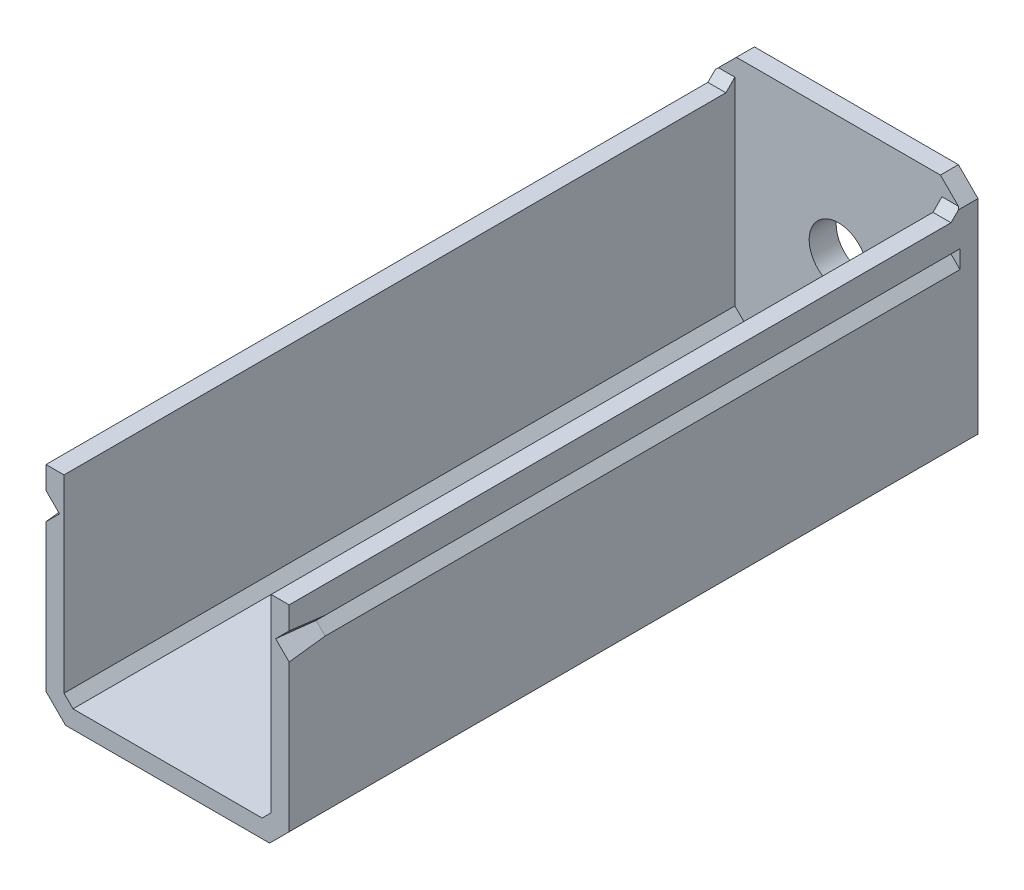
ISO-10303-21;
HEADER;
FILE_DESCRIPTION(('STEP AP214'),'2;1');
FILE_NAME('part.step','',(''),(''),'','','');
FILE_SCHEMA(('AUTOMOTIVE_DESIGN { 1 0 10303 214 1 1 1 1 }'));
ENDSEC;
DATA;
#1=APPLICATION_CONTEXT('core data for automotive mechanical design processes');
#2=APPLICATION_PROTOCOL_DEFINITION('international standard','automotive_design',2000,#1);
#3=PRODUCT_CONTEXT('',#1,'mechanical');
#4=PRODUCT('Part','Part','',(#3));
#5=PRODUCT_RELATED_PRODUCT_CATEGORY('part','',(#4));
#6=PRODUCT_DEFINITION_FORMATION('','',#4);
#7=PRODUCT_DEFINITION_CONTEXT('part definition',#1,'design');
#8=PRODUCT_DEFINITION('design','',#6,#7);
#9=PRODUCT_DEFINITION_SHAPE('','',#8);
#10=(LENGTH_UNIT() NAMED_UNIT(*) SI_UNIT(.MILLI.,.METRE.));
#11=(NAMED_UNIT(*) PLANE_ANGLE_UNIT() SI_UNIT($,.RADIAN.));
#12=(NAMED_UNIT(*) SI_UNIT($,.STERADIAN.) SOLID_ANGLE_UNIT());
#13=UNCERTAINTY_MEASURE_WITH_UNIT(LENGTH_MEASURE(1.E-05),#10,'distance_accuracy_value','');
#14=(GEOMETRIC_REPRESENTATION_CONTEXT(3) GLOBAL_UNCERTAINTY_ASSIGNED_CONTEXT((#13)) GLOBAL_UNIT_ASSIGNED_CONTEXT((#10,
#11,#12)) REPRESENTATION_CONTEXT('',''));
#15=CARTESIAN_POINT('',(0.,0.,0.));
#16=DIRECTION('',(0.,0.,1.));
#17=DIRECTION('',(1.,0.,0.));
#18=AXIS2_PLACEMENT_3D('',#15,#16,#17);
#19=CARTESIAN_POINT('',(13.5,27.,-38.25));
#20=DIRECTION('',(-1.,0.,0.));
#21=DIRECTION('',(0.,0.,1.));
#22=AXIS2_PLACEMENT_3D('',#19,#20,#21);
#23=PLANE('',#22);
#24=DIRECTION('',(0.,-1.,0.));
#25=VECTOR('',#24,1.);
#26=CARTESIAN_POINT('',(13.5,27.,38.25));
#27=LINE('',#26,#25);
#28=CARTESIAN_POINT('',(13.5,24.,38.25));
#29=VERTEX_POINT('',#28);
#30=CARTESIAN_POINT('',(13.5,21.494910618049,38.25));
#31=VERTEX_POINT('',#30);
#32=EDGE_CURVE('E551',#29,#31,#27,.T.);
#33=ORIENTED_EDGE('',*,*,#32,.T.);
#34=DIRECTION('',(0.,-0.122791346617475,-0.992432509138968));
#35=VECTOR('',#34,1.);
#36=CARTESIAN_POINT('',(13.5,21.3328635520294,36.9402922660383));
#37=LINE('',#36,#35);
#38=CARTESIAN_POINT('',(13.5,21.,34.2499999999999));
#39=VERTEX_POINT('',#38);
#40=EDGE_CURVE('E606',#31,#39,#37,.T.);
#41=ORIENTED_EDGE('',*,*,#40,.T.);
#42=DIRECTION('',(0.,0.,1.));
#43=VECTOR('',#42,1.);
#44=CARTESIAN_POINT('',(13.5,21.,-75.0467389859482));
#45=LINE('',#44,#43);
#46=CARTESIAN_POINT('',(13.5,21.,-36.25));
#47=VERTEX_POINT('',#46);
#48=EDGE_CURVE('E376',#47,#39,#45,.T.);
#49=ORIENTED_EDGE('',*,*,#48,.F.);
#50=DIRECTION('',(0.,-1.,0.));
#51=VECTOR('',#50,1.);
#52=CARTESIAN_POINT('',(13.5,0.,-36.25));
#53=LINE('',#52,#51);
#54=CARTESIAN_POINT('',(13.5,19.,-36.25));
#55=VERTEX_POINT('',#54);
#56=EDGE_CURVE('E368',#47,#55,#53,.T.);
#57=ORIENTED_EDGE('',*,*,#56,.T.);
#58=DIRECTION('',(0.,0.,1.));
#59=VECTOR('',#58,1.);
#60=CARTESIAN_POINT('',(13.5,19.,-75.0467389859482));
#61=LINE('',#60,#59);
#62=CARTESIAN_POINT('',(13.5,19.,34.2499999999998));
#63=VERTEX_POINT('',#62);
#64=EDGE_CURVE('E380',#55,#63,#61,.T.);
#65=ORIENTED_EDGE('',*,*,#64,.T.);
#66=DIRECTION('',(0.,-0.122791346617474,0.992432509138968));
#67=VECTOR('',#66,1.);
#68=CARTESIAN_POINT('',(13.5,18.7726804515995,36.0872573964694));
#69=LINE('',#68,#67);
#70=CARTESIAN_POINT('',(13.5,18.505089381951,38.25));
#71=VERTEX_POINT('',#70);
#72=EDGE_CURVE('E603',#63,#71,#69,.T.);
#73=ORIENTED_EDGE('',*,*,#72,.T.);
#74=CARTESIAN_POINT('',(13.5,2.1715728752538,38.25));
#75=VERTEX_POINT('',#74);
#76=EDGE_CURVE('E541',#71,#75,#27,.T.);
#77=ORIENTED_EDGE('',*,*,#76,.T.);
#78=DIRECTION('',(0.,0.,1.));
#79=VECTOR('',#78,1.);
#80=CARTESIAN_POINT('',(13.5,2.1715728752538,-39.25));
#81=LINE('',#80,#79);
#82=CARTESIAN_POINT('',(13.5,2.1715728752538,-38.25));
#83=VERTEX_POINT('',#82);
#84=EDGE_CURVE('E484',#83,#75,#81,.T.);
#85=ORIENTED_EDGE('',*,*,#84,.F.);
#86=DIRECTION('',(0.,-1.,0.));
#87=VECTOR('',#86,1.);
#88=CARTESIAN_POINT('',(13.5,27.,-38.25));
#89=LINE('',#88,#87);
#90=CARTESIAN_POINT('',(13.5,24.8284271247462,-38.25));
#91=VERTEX_POINT('',#90);
#92=EDGE_CURVE('E536',#91,#83,#89,.T.);
#93=ORIENTED_EDGE('',*,*,#92,.F.);
#94=DIRECTION('',(0.,0.,1.));
#95=VECTOR('',#94,1.);
#96=CARTESIAN_POINT('',(13.5,24.8284271247462,-39.25));
#97=LINE('',#96,#95);
#98=CARTESIAN_POINT('',(13.5,24.8284271247462,-36.0784271247462));
#99=VERTEX_POINT('',#98);
#100=EDGE_CURVE('E156',#91,#99,#97,.T.);
#101=ORIENTED_EDGE('',*,*,#100,.T.);
#102=DIRECTION('',(0.,0.70710678118655,-0.707106781186545));
#103=VECTOR('',#102,1.);
#104=CARTESIAN_POINT('',(13.5,27.,-38.25));
#105=LINE('',#104,#103);
#106=CARTESIAN_POINT('',(13.5,24.,-35.25));
#107=VERTEX_POINT('',#106);
#108=EDGE_CURVE('E149',#99,#107,#105,.F.);
#109=ORIENTED_EDGE('',*,*,#108,.T.);
#110=DIRECTION('',(0.,0.,1.));
#111=VECTOR('',#110,1.);
#112=CARTESIAN_POINT('',(13.5,24.,-75.0467389859482));
#113=LINE('',#112,#111);
#114=EDGE_CURVE('E354',#107,#29,#113,.T.);
#115=ORIENTED_EDGE('',*,*,#114,.T.);
#116=EDGE_LOOP('',(#33,#41,#49,#57,#65,#73,#77,#85,#93,#101,#109,#115));
#117=FACE_BOUND('',#116,.T.);
#118=ADVANCED_FACE('F139',(#117),#23,.F.);
#119=CARTESIAN_POINT('',(-13.5,27.,-38.25));
#120=DIRECTION('',(1.,0.,0.));
#121=DIRECTION('',(0.,0.,-1.));
#122=AXIS2_PLACEMENT_3D('',#119,#120,#121);
#123=PLANE('',#122);
#124=DIRECTION('',(0.,0.,1.));
#125=VECTOR('',#124,1.);
#126=CARTESIAN_POINT('',(-13.5,21.,-75.0467389859482));
#127=LINE('',#126,#125);
#128=CARTESIAN_POINT('',(-13.5,21.,-36.25));
#129=VERTEX_POINT('',#128);
#130=CARTESIAN_POINT('',(-13.5,21.,34.2499999999999));
#131=VERTEX_POINT('',#130);
#132=EDGE_CURVE('E332',#129,#131,#127,.T.);
#133=ORIENTED_EDGE('',*,*,#132,.T.);
#134=DIRECTION('',(0.,-0.122791346617472,-0.992432509138968));
#135=VECTOR('',#134,1.);
#136=CARTESIAN_POINT('',(-13.5,20.7399094196287,32.1478783571336));
#137=LINE('',#136,#135);
#138=CARTESIAN_POINT('',(-13.5,21.494910618049,38.25));
#139=VERTEX_POINT('',#138);
#140=EDGE_CURVE('E580',#131,#139,#137,.F.);
#141=ORIENTED_EDGE('',*,*,#140,.T.);
#142=DIRECTION('',(0.,-1.,0.));
#143=VECTOR('',#142,1.);
#144=CARTESIAN_POINT('',(-13.5,27.,38.25));
#145=LINE('',#144,#143);
#146=CARTESIAN_POINT('',(-13.5,24.,38.25));
#147=VERTEX_POINT('',#146);
#148=EDGE_CURVE('E555',#147,#139,#145,.T.);
#149=ORIENTED_EDGE('',*,*,#148,.F.);
#150=DIRECTION('',(0.,0.,1.));
#151=VECTOR('',#150,1.);
#152=CARTESIAN_POINT('',(-13.5,24.,-75.0467389859482));
#153=LINE('',#152,#151);
#154=CARTESIAN_POINT('',(-13.5,24.,-35.25));
#155=VERTEX_POINT('',#154);
#156=EDGE_CURVE('E425',#155,#147,#153,.T.);
#157=ORIENTED_EDGE('',*,*,#156,.F.);
#158=DIRECTION('',(0.,-0.70710678118655,0.707106781186545));
#159=VECTOR('',#158,1.);
#160=CARTESIAN_POINT('',(-13.5,27.,-38.25));
#161=LINE('',#160,#159);
#162=CARTESIAN_POINT('',(-13.5,24.8284271247462,-36.0784271247462));
#163=VERTEX_POINT('',#162);
#164=EDGE_CURVE('E635',#155,#163,#161,.F.);
#165=ORIENTED_EDGE('',*,*,#164,.T.);
#166=DIRECTION('',(0.,0.,1.));
#167=VECTOR('',#166,1.);
#168=CARTESIAN_POINT('',(-13.5,24.8284271247462,-39.25));
#169=LINE('',#168,#167);
#170=CARTESIAN_POINT('',(-13.5,24.8284271247462,-38.25));
#171=VERTEX_POINT('',#170);
#172=EDGE_CURVE('E164',#171,#163,#169,.T.);
#173=ORIENTED_EDGE('',*,*,#172,.F.);
#174=DIRECTION('',(0.,-1.,0.));
#175=VECTOR('',#174,1.);
#176=CARTESIAN_POINT('',(-13.5,27.,-38.25));
#177=LINE('',#176,#175);
#178=CARTESIAN_POINT('',(-13.5,2.1715728752538,-38.25));
#179=VERTEX_POINT('',#178);
#180=EDGE_CURVE('E556',#171,#179,#177,.T.);
#181=ORIENTED_EDGE('',*,*,#180,.T.);
#182=DIRECTION('',(0.,0.,1.));
#183=VECTOR('',#182,1.);
#184=CARTESIAN_POINT('',(-13.5,2.1715728752538,-39.25));
#185=LINE('',#184,#183);
#186=CARTESIAN_POINT('',(-13.5,2.1715728752538,38.25));
#187=VERTEX_POINT('',#186);
#188=EDGE_CURVE('E493',#179,#187,#185,.T.);
#189=ORIENTED_EDGE('',*,*,#188,.T.);
#190=CARTESIAN_POINT('',(-13.5,18.505089381951,38.25));
#191=VERTEX_POINT('',#190);
#192=EDGE_CURVE('E552',#191,#187,#145,.T.);
#193=ORIENTED_EDGE('',*,*,#192,.F.);
#194=DIRECTION('',(0.,-0.122791346617473,0.992432509138968));
#195=VECTOR('',#194,1.);
#196=CARTESIAN_POINT('',(-13.5,18.9585362842887,34.5851208416162));
#197=LINE('',#196,#195);
#198=CARTESIAN_POINT('',(-13.5,19.,34.2499999999998));
#199=VERTEX_POINT('',#198);
#200=EDGE_CURVE('E577',#191,#199,#197,.F.);
#201=ORIENTED_EDGE('',*,*,#200,.T.);
#202=DIRECTION('',(0.,0.,1.));
#203=VECTOR('',#202,1.);
#204=CARTESIAN_POINT('',(-13.5,19.,-75.0467389859482));
#205=LINE('',#204,#203);
#206=CARTESIAN_POINT('',(-13.5,19.,-36.25));
#207=VERTEX_POINT('',#206);
#208=EDGE_CURVE('E343',#207,#199,#205,.T.);
#209=ORIENTED_EDGE('',*,*,#208,.F.);
#210=DIRECTION('',(0.,1.,0.));
#211=VECTOR('',#210,1.);
#212=CARTESIAN_POINT('',(-13.5,0.,-36.25));
#213=LINE('',#212,#211);
#214=EDGE_CURVE('E349',#207,#129,#213,.T.);
#215=ORIENTED_EDGE('',*,*,#214,.T.);
#216=EDGE_LOOP('',(#133,#141,#149,#157,#165,#173,#181,#189,#193,#201,#209,#215));
#217=FACE_BOUND('',#216,.T.);
#218=ADVANCED_FACE('F356',(#217),#123,.F.);
#219=CARTESIAN_POINT('',(-13.5,27.,38.25));
#220=DIRECTION('',(0.,0.,-1.));
#221=DIRECTION('',(-1.,0.,0.));
#222=AXIS2_PLACEMENT_3D('',#219,#220,#221);
#223=PLANE('',#222);
#224=DIRECTION('',(-0.707106781186549,0.707106781186546,0.));
#225=VECTOR('',#224,1.);
#226=CARTESIAN_POINT('',(12.2525446909755,19.7525446909755,38.25));
#227=LINE('',#226,#225);
#228=CARTESIAN_POINT('',(12.005089381951,20.,38.25));
#229=VERTEX_POINT('',#228);
#230=EDGE_CURVE('E592',#71,#229,#227,.T.);
#231=ORIENTED_EDGE('',*,*,#230,.T.);
#232=DIRECTION('',(0.707106781186551,0.707106781186544,0.));
#233=VECTOR('',#232,1.);
#234=CARTESIAN_POINT('',(13.2525446909755,21.2474553090245,38.25));
#235=LINE('',#234,#233);
#236=EDGE_CURVE('E599',#229,#31,#235,.T.);
#237=ORIENTED_EDGE('',*,*,#236,.T.);
#238=ORIENTED_EDGE('',*,*,#32,.F.);
#239=DIRECTION('',(-1.,0.,0.));
#240=VECTOR('',#239,1.);
#241=CARTESIAN_POINT('',(0.,24.,38.25));
#242=LINE('',#241,#240);
#243=CARTESIAN_POINT('',(11.5,24.,38.25));
#244=VERTEX_POINT('',#243);
#245=EDGE_CURVE('E392',#29,#244,#242,.T.);
#246=ORIENTED_EDGE('',*,*,#245,.T.);
#247=DIRECTION('',(0.,-1.,0.));
#248=VECTOR('',#247,1.);
#249=CARTESIAN_POINT('',(11.5,0.,38.25));
#250=LINE('',#249,#248);
#251=CARTESIAN_POINT('',(11.5,2.99999999999999,38.25));
#252=VERTEX_POINT('',#251);
#253=EDGE_CURVE('E397',#244,#252,#250,.T.);
#254=ORIENTED_EDGE('',*,*,#253,.T.);
#255=DIRECTION('',(0.707106781186557,0.707106781186538,0.));
#256=VECTOR('',#255,1.);
#257=CARTESIAN_POINT('',(4.24999999999985,-4.24999999999996,38.25));
#258=LINE('',#257,#256);
#259=CARTESIAN_POINT('',(10.5,2.00000000000001,38.25));
#260=VERTEX_POINT('',#259);
#261=EDGE_CURVE('E403',#260,#252,#258,.T.);
#262=ORIENTED_EDGE('',*,*,#261,.F.);
#263=DIRECTION('',(1.,0.,0.));
#264=VECTOR('',#263,1.);
#265=CARTESIAN_POINT('',(0.,2.00000000000001,38.25));
#266=LINE('',#265,#264);
#267=CARTESIAN_POINT('',(-10.5,2.00000000000001,38.25));
#268=VERTEX_POINT('',#267);
#269=EDGE_CURVE('E408',#268,#260,#266,.T.);
#270=ORIENTED_EDGE('',*,*,#269,.F.);
#271=DIRECTION('',(0.707106781186549,-0.707106781186546,0.));
#272=VECTOR('',#271,1.);
#273=CARTESIAN_POINT('',(-4.24999999999999,-4.25,38.25));
#274=LINE('',#273,#272);
#275=CARTESIAN_POINT('',(-11.5,2.99999999999999,38.25));
#276=VERTEX_POINT('',#275);
#277=EDGE_CURVE('E412',#276,#268,#274,.T.);
#278=ORIENTED_EDGE('',*,*,#277,.F.);
#279=DIRECTION('',(0.,-1.,0.));
#280=VECTOR('',#279,1.);
#281=CARTESIAN_POINT('',(-11.5,0.,38.25));
#282=LINE('',#281,#280);
#283=CARTESIAN_POINT('',(-11.5,24.,38.25));
#284=VERTEX_POINT('',#283);
#285=EDGE_CURVE('E416',#284,#276,#282,.T.);
#286=ORIENTED_EDGE('',*,*,#285,.F.);
#287=DIRECTION('',(-1.,0.,0.));
#288=VECTOR('',#287,1.);
#289=CARTESIAN_POINT('',(0.,24.,38.25));
#290=LINE('',#289,#288);
#291=EDGE_CURVE('E421',#284,#147,#290,.T.);
#292=ORIENTED_EDGE('',*,*,#291,.T.);
#293=ORIENTED_EDGE('',*,*,#148,.T.);
#294=DIRECTION('',(0.707106781186549,-0.707106781186546,0.));
#295=VECTOR('',#294,1.);
#296=CARTESIAN_POINT('',(-16.2525446909755,24.2474553090245,38.25));
#297=LINE('',#296,#295);
#298=CARTESIAN_POINT('',(-12.005089381951,20.,38.25));
#299=VERTEX_POINT('',#298);
#300=EDGE_CURVE('E586',#139,#299,#297,.T.);
#301=ORIENTED_EDGE('',*,*,#300,.T.);
#302=DIRECTION('',(-0.707106781186549,-0.707106781186546,0.));
#303=VECTOR('',#302,1.);
#304=CARTESIAN_POINT('',(-9.2525446909755,22.7525446909755,38.25));
#305=LINE('',#304,#303);
#306=EDGE_CURVE('E583',#299,#191,#305,.T.);
#307=ORIENTED_EDGE('',*,*,#306,.T.);
#308=ORIENTED_EDGE('',*,*,#192,.T.);
#309=DIRECTION('',(0.707106781186548,-0.707106781186547,0.));
#310=VECTOR('',#309,1.);
#311=CARTESIAN_POINT('',(-5.6642135623731,-5.6642135623731,38.25));
#312=LINE('',#311,#310);
#313=CARTESIAN_POINT('',(-11.3284271247462,0.,38.25));
#314=VERTEX_POINT('',#313);
#315=EDGE_CURVE('E481',#187,#314,#312,.T.);
#316=ORIENTED_EDGE('',*,*,#315,.T.);
#317=DIRECTION('',(1.,0.,0.));
#318=VECTOR('',#317,1.);
#319=CARTESIAN_POINT('',(-13.5,0.,38.25));
#320=LINE('',#319,#318);
#321=CARTESIAN_POINT('',(11.3284271247462,0.,38.25));
#322=VERTEX_POINT('',#321);
#323=EDGE_CURVE('E542',#314,#322,#320,.T.);
#324=ORIENTED_EDGE('',*,*,#323,.T.);
#325=DIRECTION('',(-0.707106781186548,-0.707106781186547,0.));
#326=VECTOR('',#325,1.);
#327=CARTESIAN_POINT('',(5.66421356237309,-5.6642135623731,38.25));
#328=LINE('',#327,#326);
#329=EDGE_CURVE('E431',#75,#322,#328,.T.);
#330=ORIENTED_EDGE('',*,*,#329,.F.);
#331=ORIENTED_EDGE('',*,*,#76,.F.);
#332=EDGE_LOOP('',(#231,#237,#238,#246,#254,#262,#270,#278,#286,#292,#293,#301,#307,#308,#316,
#324,#330,#331));
#333=FACE_BOUND('',#332,.T.);
#334=ADVANCED_FACE('F663',(#333),#223,.F.);
#335=CARTESIAN_POINT('',(0.,27.,0.));
#336=DIRECTION('',(0.,1.,0.));
#337=DIRECTION('',(0.,0.,1.));
#338=AXIS2_PLACEMENT_3D('',#335,#336,#337);
#339=PLANE('',#338);
#340=DIRECTION('',(0.,0.,-1.));
#341=VECTOR('',#340,1.);
#342=CARTESIAN_POINT('',(-11.3284271247462,27.,0.));
#343=LINE('',#342,#341);
#344=CARTESIAN_POINT('',(-11.3284271247462,27.,-36.25));
#345=VERTEX_POINT('',#344);
#346=CARTESIAN_POINT('',(-11.3284271247462,27.,-38.25));
#347=VERTEX_POINT('',#346);
#348=EDGE_CURVE('E569',#345,#347,#343,.T.);
#349=ORIENTED_EDGE('',*,*,#348,.F.);
#350=DIRECTION('',(1.,0.,0.));
#351=VECTOR('',#350,1.);
#352=CARTESIAN_POINT('',(0.,27.,-36.25));
#353=LINE('',#352,#351);
#354=CARTESIAN_POINT('',(11.3284271247462,27.,-36.25));
#355=VERTEX_POINT('',#354);
#356=EDGE_CURVE('E432',#345,#355,#353,.T.);
#357=ORIENTED_EDGE('',*,*,#356,.T.);
#358=DIRECTION('',(0.,0.,-1.));
#359=VECTOR('',#358,1.);
#360=CARTESIAN_POINT('',(11.3284271247462,27.,0.));
#361=LINE('',#360,#359);
#362=CARTESIAN_POINT('',(11.3284271247462,27.,-38.25));
#363=VERTEX_POINT('',#362);
#364=EDGE_CURVE('E572',#355,#363,#361,.T.);
#365=ORIENTED_EDGE('',*,*,#364,.T.);
#366=DIRECTION('',(-1.,0.,0.));
#367=VECTOR('',#366,1.);
#368=CARTESIAN_POINT('',(-13.5,27.,-38.25));
#369=LINE('',#368,#367);
#370=EDGE_CURVE('E537',#363,#347,#369,.T.);
#371=ORIENTED_EDGE('',*,*,#370,.T.);
#372=EDGE_LOOP('',(#349,#357,#365,#371));
#373=FACE_BOUND('',#372,.T.);
#374=ADVANCED_FACE('F737',(#373),#339,.T.);
#375=CARTESIAN_POINT('',(0.,10.65,38.25));
#376=DIRECTION('',(0.,-1.,0.));
#377=DIRECTION('',(1.,0.,0.));
#378=AXIS2_PLACEMENT_3D('',#375,#376,#377);
#379=PLANE('',#378);
#380=DIRECTION('',(1.,0.,0.));
#381=VECTOR('',#380,1.);
#382=CARTESIAN_POINT('',(0.,10.65,-36.25));
#383=LINE('',#382,#381);
#384=CARTESIAN_POINT('',(-1.56204993518134,10.65,-36.25));
#385=VERTEX_POINT('',#384);
#386=CARTESIAN_POINT('',(1.56204993518132,10.65,-36.25));
#387=VERTEX_POINT('',#386);
#388=EDGE_CURVE('E407',#385,#387,#383,.T.);
#389=ORIENTED_EDGE('',*,*,#388,.T.);
#390=DIRECTION('',(0.,0.,-1.));
#391=VECTOR('',#390,1.);
#392=CARTESIAN_POINT('',(1.56204993518132,10.65,38.25));
#393=LINE('',#392,#391);
#394=CARTESIAN_POINT('',(1.56204993518132,10.65,-39.25));
#395=VERTEX_POINT('',#394);
#396=EDGE_CURVE('E521',#387,#395,#393,.T.);
#397=ORIENTED_EDGE('',*,*,#396,.T.);
#398=DIRECTION('',(-1.,0.,0.));
#399=VECTOR('',#398,1.);
#400=CARTESIAN_POINT('',(0.,10.65,-39.25));
#401=LINE('',#400,#399);
#402=CARTESIAN_POINT('',(-1.56204993518134,10.65,-39.25));
#403=VERTEX_POINT('',#402);
#404=EDGE_CURVE('E512',#395,#403,#401,.T.);
#405=ORIENTED_EDGE('',*,*,#404,.T.);
#406=DIRECTION('',(0.,0.,-1.));
#407=VECTOR('',#406,1.);
#408=CARTESIAN_POINT('',(-1.56204993518134,10.65,38.25));
#409=LINE('',#408,#407);
#410=EDGE_CURVE('E520',#385,#403,#409,.T.);
#411=ORIENTED_EDGE('',*,*,#410,.F.);
#412=EDGE_LOOP('',(#389,#397,#405,#411));
#413=FACE_BOUND('',#412,.T.);
#414=ADVANCED_FACE('F739',(#413),#379,.F.);
#415=CARTESIAN_POINT('',(0.,13.5,38.25));
#416=DIRECTION('',(0.,0.,-1.));
#417=DIRECTION('',(-1.,0.,0.));
#418=AXIS2_PLACEMENT_3D('',#415,#416,#417);
#419=CYLINDRICAL_SURFACE('',#418,3.25);
#420=CARTESIAN_POINT('',(0.,13.5,-36.25));
#421=DIRECTION('',(0.,0.,1.));
#422=DIRECTION('',(1.,0.,0.));
#423=AXIS2_PLACEMENT_3D('',#420,#421,#422);
#424=CIRCLE('',#423,3.25);
#425=EDGE_CURVE('E455',#387,#385,#424,.T.);
#426=ORIENTED_EDGE('',*,*,#425,.T.);
#427=ORIENTED_EDGE('',*,*,#410,.T.);
#428=CARTESIAN_POINT('',(0.,13.5,-39.25));
#429=DIRECTION('',(0.,0.,-1.));
#430=DIRECTION('',(-1.,0.,0.));
#431=AXIS2_PLACEMENT_3D('',#428,#429,#430);
#432=CIRCLE('',#431,3.25);
#433=EDGE_CURVE('E516',#403,#395,#432,.T.);
#434=ORIENTED_EDGE('',*,*,#433,.T.);
#435=ORIENTED_EDGE('',*,*,#396,.F.);
#436=EDGE_LOOP('',(#426,#427,#434,#435));
#437=FACE_BOUND('',#436,.T.);
#438=ADVANCED_FACE('F745',(#437),#419,.F.);
#439=CARTESIAN_POINT('',(-19.1642135623731,19.1642135623731,-39.25));
#440=DIRECTION('',(0.707106781186547,-0.707106781186548,0.));
#441=DIRECTION('',(0.707106781186548,0.707106781186547,0.));
#442=AXIS2_PLACEMENT_3D('',#439,#440,#441);
#443=PLANE('',#442);
#444=DIRECTION('',(-0.707106781186548,-0.707106781186547,0.));
#445=VECTOR('',#444,1.);
#446=CARTESIAN_POINT('',(-19.1642135623731,19.1642135623731,-36.25));
#447=LINE('',#446,#445);
#448=CARTESIAN_POINT('',(-13.3284271247462,25.,-36.25));
#449=VERTEX_POINT('',#448);
#450=EDGE_CURVE('E420',#345,#449,#447,.T.);
#451=ORIENTED_EDGE('',*,*,#450,.F.);
#452=ORIENTED_EDGE('',*,*,#348,.T.);
#453=DIRECTION('',(0.707106781186548,0.707106781186547,0.));
#454=VECTOR('',#453,1.);
#455=CARTESIAN_POINT('',(-12.4142135623731,25.9142135623731,-38.25));
#456=LINE('',#455,#454);
#457=EDGE_CURVE('E504',#171,#347,#456,.T.);
#458=ORIENTED_EDGE('',*,*,#457,.F.);
#459=ORIENTED_EDGE('',*,*,#172,.T.);
#460=DIRECTION('',(-0.577350269189627,-0.577350269189627,0.577350269189623));
#461=VECTOR('',#460,1.);
#462=CARTESIAN_POINT('',(-16.2189514164975,22.1094757082487,-33.3594757082487));
#463=LINE('',#462,#461);
#464=EDGE_CURVE('E638',#163,#449,#463,.F.);
#465=ORIENTED_EDGE('',*,*,#464,.T.);
#466=EDGE_LOOP('',(#451,#452,#458,#459,#465));
#467=FACE_BOUND('',#466,.T.);
#468=ADVANCED_FACE('F734',(#467),#443,.F.);
#469=CARTESIAN_POINT('',(19.1642135623731,19.1642135623731,-39.25));
#470=DIRECTION('',(0.707106781186547,0.707106781186548,0.));
#471=DIRECTION('',(-0.707106781186548,0.707106781186547,0.));
#472=AXIS2_PLACEMENT_3D('',#469,#470,#471);
#473=PLANE('',#472);
#474=ORIENTED_EDGE('',*,*,#364,.F.);
#475=DIRECTION('',(0.707106781186548,-0.707106781186547,0.));
#476=VECTOR('',#475,1.);
#477=CARTESIAN_POINT('',(19.1642135623731,19.1642135623731,-36.25));
#478=LINE('',#477,#476);
#479=CARTESIAN_POINT('',(13.3284271247462,25.,-36.25));
#480=VERTEX_POINT('',#479);
#481=EDGE_CURVE('E427',#355,#480,#478,.T.);
#482=ORIENTED_EDGE('',*,*,#481,.T.);
#483=DIRECTION('',(-0.577350269189627,0.577350269189627,-0.577350269189623));
#484=VECTOR('',#483,1.);
#485=CARTESIAN_POINT('',(4.38561808316408,33.9428090415821,-45.1928090415821));
#486=LINE('',#485,#484);
#487=EDGE_CURVE('E641',#480,#99,#486,.F.);
#488=ORIENTED_EDGE('',*,*,#487,.T.);
#489=ORIENTED_EDGE('',*,*,#100,.F.);
#490=DIRECTION('',(-0.707106781186548,0.707106781186547,0.));
#491=VECTOR('',#490,1.);
#492=CARTESIAN_POINT('',(-1.08578643762691,39.4142135623731,-38.25));
#493=LINE('',#492,#491);
#494=EDGE_CURVE('E508',#91,#363,#493,.T.);
#495=ORIENTED_EDGE('',*,*,#494,.T.);
#496=EDGE_LOOP('',(#474,#482,#488,#489,#495));
#497=FACE_BOUND('',#496,.T.);
#498=ADVANCED_FACE('F704',(#497),#473,.T.);
#499=CARTESIAN_POINT('',(-13.5,27.,-38.25));
#500=DIRECTION('',(0.,0.,1.));
#501=DIRECTION('',(1.,0.,0.));
#502=AXIS2_PLACEMENT_3D('',#499,#500,#501);
#503=PLANE('',#502);
#504=CARTESIAN_POINT('',(0.,13.5,-38.25));
#505=DIRECTION('',(0.,0.,1.));
#506=DIRECTION('',(1.,0.,0.));
#507=AXIS2_PLACEMENT_3D('',#504,#505,#506);
#508=CIRCLE('',#507,5.75);
#509=CARTESIAN_POINT('',(5.74999999999999,13.5,-38.25));
#510=VERTEX_POINT('',#509);
#511=EDGE_CURVE('E531',#510,#510,#508,.F.);
#512=ORIENTED_EDGE('',*,*,#511,.F.);
#513=EDGE_LOOP('',(#512));
#514=FACE_BOUND('',#513,.T.);
#515=ORIENTED_EDGE('',*,*,#92,.T.);
#516=DIRECTION('',(-0.707106781186548,-0.707106781186547,0.));
#517=VECTOR('',#516,1.);
#518=CARTESIAN_POINT('',(12.4142135623731,1.08578643762689,-38.25));
#519=LINE('',#518,#517);
#520=CARTESIAN_POINT('',(11.3284271247462,0.,-38.25));
#521=VERTEX_POINT('',#520);
#522=EDGE_CURVE('E500',#83,#521,#519,.T.);
#523=ORIENTED_EDGE('',*,*,#522,.T.);
#524=DIRECTION('',(-1.,0.,0.));
#525=VECTOR('',#524,1.);
#526=CARTESIAN_POINT('',(-13.5,0.,-38.25));
#527=LINE('',#526,#525);
#528=CARTESIAN_POINT('',(-11.3284271247462,0.,-38.25));
#529=VERTEX_POINT('',#528);
#530=EDGE_CURVE('E530',#521,#529,#527,.T.);
#531=ORIENTED_EDGE('',*,*,#530,.T.);
#532=DIRECTION('',(0.707106781186548,-0.707106781186547,0.));
#533=VECTOR('',#532,1.);
#534=CARTESIAN_POINT('',(-25.9142135623731,14.5857864376269,-38.25));
#535=LINE('',#534,#533);
#536=EDGE_CURVE('E497',#179,#529,#535,.T.);
#537=ORIENTED_EDGE('',*,*,#536,.F.);
#538=ORIENTED_EDGE('',*,*,#180,.F.);
#539=ORIENTED_EDGE('',*,*,#457,.T.);
#540=ORIENTED_EDGE('',*,*,#370,.F.);
#541=ORIENTED_EDGE('',*,*,#494,.F.);
#542=EDGE_LOOP('',(#515,#523,#531,#537,#538,#539,#540,#541));
#543=FACE_BOUND('',#542,.T.);
#544=ADVANCED_FACE('F689',(#514,#543),#503,.F.);
#545=CARTESIAN_POINT('',(0.,0.,0.));
#546=DIRECTION('',(0.,1.,0.));
#547=DIRECTION('',(0.,0.,1.));
#548=AXIS2_PLACEMENT_3D('',#545,#546,#547);
#549=PLANE('',#548);
#550=ORIENTED_EDGE('',*,*,#530,.F.);
#551=DIRECTION('',(0.,0.,1.));
#552=VECTOR('',#551,1.);
#553=CARTESIAN_POINT('',(11.3284271247462,0.,0.));
#554=LINE('',#553,#552);
#555=EDGE_CURVE('E565',#521,#322,#554,.T.);
#556=ORIENTED_EDGE('',*,*,#555,.T.);
#557=ORIENTED_EDGE('',*,*,#323,.F.);
#558=DIRECTION('',(0.,0.,1.));
#559=VECTOR('',#558,1.);
#560=CARTESIAN_POINT('',(-11.3284271247462,0.,0.));
#561=LINE('',#560,#559);
#562=EDGE_CURVE('E535',#529,#314,#561,.T.);
#563=ORIENTED_EDGE('',*,*,#562,.F.);
#564=EDGE_LOOP('',(#550,#556,#557,#563));
#565=FACE_BOUND('',#564,.T.);
#566=ADVANCED_FACE('F692',(#565),#549,.F.);
#567=CARTESIAN_POINT('',(0.,13.5,-39.25));
#568=DIRECTION('',(0.,0.,-1.));
#569=DIRECTION('',(-1.,0.,0.));
#570=AXIS2_PLACEMENT_3D('',#567,#568,#569);
#571=PLANE('',#570);
#572=ORIENTED_EDGE('',*,*,#404,.F.);
#573=ORIENTED_EDGE('',*,*,#433,.F.);
#574=EDGE_LOOP('',(#572,#573));
#575=FACE_BOUND('',#574,.T.);
#576=CARTESIAN_POINT('',(0.,13.5,-39.25));
#577=DIRECTION('',(0.,0.,-1.));
#578=DIRECTION('',(-1.,0.,0.));
#579=AXIS2_PLACEMENT_3D('',#576,#577,#578);
#580=CIRCLE('',#579,4.75);
#581=CARTESIAN_POINT('',(-4.75000000000001,13.5,-39.25));
#582=VERTEX_POINT('',#581);
#583=EDGE_CURVE('E524',#582,#582,#580,.T.);
#584=ORIENTED_EDGE('',*,*,#583,.T.);
#585=EDGE_LOOP('',(#584));
#586=FACE_BOUND('',#585,.T.);
#587=ADVANCED_FACE('F1023',(#575,#586),#571,.T.);
#588=CARTESIAN_POINT('',(0.,13.5,-39.25));
#589=DIRECTION('',(0.,0.,1.));
#590=DIRECTION('',(-1.,0.,0.));
#591=AXIS2_PLACEMENT_3D('',#588,#589,#590);
#592=CONICAL_SURFACE('',#591,4.75,0.78539816339745);
#593=ORIENTED_EDGE('',*,*,#583,.F.);
#594=EDGE_LOOP('',(#593));
#595=FACE_BOUND('',#594,.T.);
#596=ORIENTED_EDGE('',*,*,#511,.T.);
#597=EDGE_LOOP('',(#596));
#598=FACE_BOUND('',#597,.T.);
#599=ADVANCED_FACE('F1005',(#595,#598),#592,.T.);
#600=CARTESIAN_POINT('',(-5.6642135623731,-5.6642135623731,-39.25));
#601=DIRECTION('',(-0.707106781186547,-0.707106781186548,0.));
#602=DIRECTION('',(0.707106781186548,-0.707106781186547,0.));
#603=AXIS2_PLACEMENT_3D('',#600,#601,#602);
#604=PLANE('',#603);
#605=ORIENTED_EDGE('',*,*,#536,.T.);
#606=ORIENTED_EDGE('',*,*,#562,.T.);
#607=ORIENTED_EDGE('',*,*,#315,.F.);
#608=ORIENTED_EDGE('',*,*,#188,.F.);
#609=EDGE_LOOP('',(#605,#606,#607,#608));
#610=FACE_BOUND('',#609,.T.);
#611=ADVANCED_FACE('F686',(#610),#604,.T.);
#612=CARTESIAN_POINT('',(5.66421356237309,-5.6642135623731,-39.25));
#613=DIRECTION('',(-0.707106781186547,0.707106781186548,0.));
#614=DIRECTION('',(-0.707106781186548,-0.707106781186547,0.));
#615=AXIS2_PLACEMENT_3D('',#612,#613,#614);
#616=PLANE('',#615);
#617=ORIENTED_EDGE('',*,*,#84,.T.);
#618=ORIENTED_EDGE('',*,*,#329,.T.);
#619=ORIENTED_EDGE('',*,*,#555,.F.);
#620=ORIENTED_EDGE('',*,*,#522,.F.);
#621=EDGE_LOOP('',(#617,#618,#619,#620));
#622=FACE_BOUND('',#621,.T.);
#623=ADVANCED_FACE('F698',(#622),#616,.F.);
#624=CARTESIAN_POINT('',(0.,24.,-75.0467389859482));
#625=DIRECTION('',(0.,1.,0.));
#626=DIRECTION('',(0.,0.,1.));
#627=AXIS2_PLACEMENT_3D('',#624,#625,#626);
#628=PLANE('',#627);
#629=ORIENTED_EDGE('',*,*,#114,.F.);
#630=DIRECTION('',(-1.,0.,0.));
#631=VECTOR('',#630,1.);
#632=CARTESIAN_POINT('',(11.5,24.,-35.25));
#633=LINE('',#632,#631);
#634=CARTESIAN_POINT('',(11.5,24.,-35.25));
#635=VERTEX_POINT('',#634);
#636=EDGE_CURVE('E629',#107,#635,#633,.T.);
#637=ORIENTED_EDGE('',*,*,#636,.T.);
#638=DIRECTION('',(0.,0.,1.));
#639=VECTOR('',#638,1.);
#640=CARTESIAN_POINT('',(11.5,24.,-75.0467389859482));
#641=LINE('',#640,#639);
#642=EDGE_CURVE('E402',#635,#244,#641,.T.);
#643=ORIENTED_EDGE('',*,*,#642,.T.);
#644=ORIENTED_EDGE('',*,*,#245,.F.);
#645=EDGE_LOOP('',(#629,#637,#643,#644));
#646=FACE_BOUND('',#645,.T.);
#647=ADVANCED_FACE('F651',(#646),#628,.T.);
#648=CARTESIAN_POINT('',(11.5,0.,-75.0467389859482));
#649=DIRECTION('',(-1.,0.,0.));
#650=DIRECTION('',(0.,-1.,0.));
#651=AXIS2_PLACEMENT_3D('',#648,#649,#650);
#652=PLANE('',#651);
#653=DIRECTION('',(0.,0.,1.));
#654=VECTOR('',#653,1.);
#655=CARTESIAN_POINT('',(11.5,2.99999999999999,-75.0467389859482));
#656=LINE('',#655,#654);
#657=CARTESIAN_POINT('',(11.5,2.99999999999999,-36.25));
#658=VERTEX_POINT('',#657);
#659=EDGE_CURVE('E401',#658,#252,#656,.T.);
#660=ORIENTED_EDGE('',*,*,#659,.T.);
#661=ORIENTED_EDGE('',*,*,#253,.F.);
#662=ORIENTED_EDGE('',*,*,#642,.F.);
#663=DIRECTION('',(0.,-0.70710678118655,0.707106781186545));
#664=VECTOR('',#663,1.);
#665=CARTESIAN_POINT('',(11.5,25.,-36.25));
#666=LINE('',#665,#664);
#667=CARTESIAN_POINT('',(11.5,25.,-36.25));
#668=VERTEX_POINT('',#667);
#669=EDGE_CURVE('E13',#635,#668,#666,.F.);
#670=ORIENTED_EDGE('',*,*,#669,.T.);
#671=DIRECTION('',(0.,1.,0.));
#672=VECTOR('',#671,1.);
#673=CARTESIAN_POINT('',(11.5,0.,-36.25));
#674=LINE('',#673,#672);
#675=EDGE_CURVE('E396',#658,#668,#674,.T.);
#676=ORIENTED_EDGE('',*,*,#675,.F.);
#677=EDGE_LOOP('',(#660,#661,#662,#670,#676));
#678=FACE_BOUND('',#677,.T.);
#679=ADVANCED_FACE('F657',(#678),#652,.T.);
#680=CARTESIAN_POINT('',(4.24999999999985,-4.24999999999996,-75.0467389859482));
#681=DIRECTION('',(0.707106781186538,-0.707106781186557,0.));
#682=DIRECTION('',(0.707106781186557,0.707106781186538,0.));
#683=AXIS2_PLACEMENT_3D('',#680,#681,#682);
#684=PLANE('',#683);
#685=DIRECTION('',(-0.707106781186557,-0.707106781186538,0.));
#686=VECTOR('',#685,1.);
#687=CARTESIAN_POINT('',(4.24999999999985,-4.24999999999996,-36.25));
#688=LINE('',#687,#686);
#689=CARTESIAN_POINT('',(10.5,2.00000000000001,-36.25));
#690=VERTEX_POINT('',#689);
#691=EDGE_CURVE('E459',#658,#690,#688,.T.);
#692=ORIENTED_EDGE('',*,*,#691,.T.);
#693=DIRECTION('',(0.,0.,1.));
#694=VECTOR('',#693,1.);
#695=CARTESIAN_POINT('',(10.5,2.00000000000001,-75.0467389859482));
#696=LINE('',#695,#694);
#697=EDGE_CURVE('E439',#690,#260,#696,.T.);
#698=ORIENTED_EDGE('',*,*,#697,.T.);
#699=ORIENTED_EDGE('',*,*,#261,.T.);
#700=ORIENTED_EDGE('',*,*,#659,.F.);
#701=EDGE_LOOP('',(#692,#698,#699,#700));
#702=FACE_BOUND('',#701,.T.);
#703=ADVANCED_FACE('F711',(#702),#684,.F.);
#704=CARTESIAN_POINT('',(0.,2.00000000000001,-75.0467389859482));
#705=DIRECTION('',(0.,-1.,0.));
#706=DIRECTION('',(0.,0.,-1.));
#707=AXIS2_PLACEMENT_3D('',#704,#705,#706);
#708=PLANE('',#707);
#709=DIRECTION('',(-1.,0.,0.));
#710=VECTOR('',#709,1.);
#711=CARTESIAN_POINT('',(0.,2.00000000000001,-36.25));
#712=LINE('',#711,#710);
#713=CARTESIAN_POINT('',(-10.5,2.00000000000001,-36.25));
#714=VERTEX_POINT('',#713);
#715=EDGE_CURVE('E464',#690,#714,#712,.T.);
#716=ORIENTED_EDGE('',*,*,#715,.T.);
#717=DIRECTION('',(0.,0.,1.));
#718=VECTOR('',#717,1.);
#719=CARTESIAN_POINT('',(-10.5,2.00000000000001,-75.0467389859482));
#720=LINE('',#719,#718);
#721=EDGE_CURVE('E442',#714,#268,#720,.T.);
#722=ORIENTED_EDGE('',*,*,#721,.T.);
#723=ORIENTED_EDGE('',*,*,#269,.T.);
#724=ORIENTED_EDGE('',*,*,#697,.F.);
#725=EDGE_LOOP('',(#716,#722,#723,#724));
#726=FACE_BOUND('',#725,.T.);
#727=ADVANCED_FACE('F715',(#726),#708,.F.);
#728=CARTESIAN_POINT('',(-4.24999999999999,-4.25,-75.0467389859482));
#729=DIRECTION('',(-0.707106781186546,-0.707106781186549,0.));
#730=DIRECTION('',(0.707106781186549,-0.707106781186546,0.));
#731=AXIS2_PLACEMENT_3D('',#728,#729,#730);
#732=PLANE('',#731);
#733=DIRECTION('',(-0.707106781186549,0.707106781186546,0.));
#734=VECTOR('',#733,1.);
#735=CARTESIAN_POINT('',(-4.24999999999999,-4.25,-36.25));
#736=LINE('',#735,#734);
#737=CARTESIAN_POINT('',(-11.5,2.99999999999999,-36.25));
#738=VERTEX_POINT('',#737);
#739=EDGE_CURVE('E467',#714,#738,#736,.T.);
#740=ORIENTED_EDGE('',*,*,#739,.T.);
#741=DIRECTION('',(0.,0.,1.));
#742=VECTOR('',#741,1.);
#743=CARTESIAN_POINT('',(-11.5,2.99999999999999,-75.0467389859482));
#744=LINE('',#743,#742);
#745=EDGE_CURVE('E445',#738,#276,#744,.T.);
#746=ORIENTED_EDGE('',*,*,#745,.T.);
#747=ORIENTED_EDGE('',*,*,#277,.T.);
#748=ORIENTED_EDGE('',*,*,#721,.F.);
#749=EDGE_LOOP('',(#740,#746,#747,#748));
#750=FACE_BOUND('',#749,.T.);
#751=ADVANCED_FACE('F718',(#750),#732,.F.);
#752=CARTESIAN_POINT('',(-11.5,0.,-75.0467389859482));
#753=DIRECTION('',(-1.,0.,0.));
#754=DIRECTION('',(0.,0.,1.));
#755=AXIS2_PLACEMENT_3D('',#752,#753,#754);
#756=PLANE('',#755);
#757=DIRECTION('',(0.,1.,0.));
#758=VECTOR('',#757,1.);
#759=CARTESIAN_POINT('',(-11.5,0.,-36.25));
#760=LINE('',#759,#758);
#761=CARTESIAN_POINT('',(-11.5,25.,-36.25));
#762=VERTEX_POINT('',#761);
#763=EDGE_CURVE('E470',#738,#762,#760,.T.);
#764=ORIENTED_EDGE('',*,*,#763,.T.);
#765=DIRECTION('',(0.,0.70710678118655,-0.707106781186545));
#766=VECTOR('',#765,1.);
#767=CARTESIAN_POINT('',(-11.5,31.898369492974,-43.148369492974));
#768=LINE('',#767,#766);
#769=CARTESIAN_POINT('',(-11.5,24.,-35.25));
#770=VERTEX_POINT('',#769);
#771=EDGE_CURVE('E632',#762,#770,#768,.F.);
#772=ORIENTED_EDGE('',*,*,#771,.T.);
#773=DIRECTION('',(0.,0.,1.));
#774=VECTOR('',#773,1.);
#775=CARTESIAN_POINT('',(-11.5,24.,-75.0467389859482));
#776=LINE('',#775,#774);
#777=EDGE_CURVE('E426',#770,#284,#776,.T.);
#778=ORIENTED_EDGE('',*,*,#777,.T.);
#779=ORIENTED_EDGE('',*,*,#285,.T.);
#780=ORIENTED_EDGE('',*,*,#745,.F.);
#781=EDGE_LOOP('',(#764,#772,#778,#779,#780));
#782=FACE_BOUND('',#781,.T.);
#783=ADVANCED_FACE('F722',(#782),#756,.F.);
#784=CARTESIAN_POINT('',(0.,24.,-75.0467389859482));
#785=DIRECTION('',(0.,1.,0.));
#786=DIRECTION('',(0.,0.,1.));
#787=AXIS2_PLACEMENT_3D('',#784,#785,#786);
#788=PLANE('',#787);
#789=ORIENTED_EDGE('',*,*,#777,.F.);
#790=DIRECTION('',(-1.,0.,0.));
#791=VECTOR('',#790,1.);
#792=CARTESIAN_POINT('',(-13.5,24.,-35.25));
#793=LINE('',#792,#791);
#794=EDGE_CURVE('E626',#770,#155,#793,.T.);
#795=ORIENTED_EDGE('',*,*,#794,.T.);
#796=ORIENTED_EDGE('',*,*,#156,.T.);
#797=ORIENTED_EDGE('',*,*,#291,.F.);
#798=EDGE_LOOP('',(#789,#795,#796,#797));
#799=FACE_BOUND('',#798,.T.);
#800=ADVANCED_FACE('F727',(#799),#788,.T.);
#801=CARTESIAN_POINT('',(-13.5,27.,-36.25));
#802=DIRECTION('',(0.,0.,1.));
#803=DIRECTION('',(1.,0.,0.));
#804=AXIS2_PLACEMENT_3D('',#801,#802,#803);
#805=PLANE('',#804);
#806=ORIENTED_EDGE('',*,*,#388,.F.);
#807=ORIENTED_EDGE('',*,*,#425,.F.);
#808=EDGE_LOOP('',(#806,#807));
#809=FACE_BOUND('',#808,.T.);
#810=ORIENTED_EDGE('',*,*,#450,.T.);
#811=DIRECTION('',(1.,0.,0.));
#812=VECTOR('',#811,1.);
#813=CARTESIAN_POINT('',(-11.5,25.,-36.25));
#814=LINE('',#813,#812);
#815=EDGE_CURVE('E622',#449,#762,#814,.T.);
#816=ORIENTED_EDGE('',*,*,#815,.T.);
#817=ORIENTED_EDGE('',*,*,#763,.F.);
#818=ORIENTED_EDGE('',*,*,#739,.F.);
#819=ORIENTED_EDGE('',*,*,#715,.F.);
#820=ORIENTED_EDGE('',*,*,#691,.F.);
#821=ORIENTED_EDGE('',*,*,#675,.T.);
#822=DIRECTION('',(1.,0.,0.));
#823=VECTOR('',#822,1.);
#824=CARTESIAN_POINT('',(13.5,25.,-36.25));
#825=LINE('',#824,#823);
#826=EDGE_CURVE('E615',#668,#480,#825,.T.);
#827=ORIENTED_EDGE('',*,*,#826,.T.);
#828=ORIENTED_EDGE('',*,*,#481,.F.);
#829=ORIENTED_EDGE('',*,*,#356,.F.);
#830=EDGE_LOOP('',(#810,#816,#817,#818,#819,#820,#821,#827,#828,#829));
#831=FACE_BOUND('',#830,.T.);
#832=ADVANCED_FACE('F706',(#809,#831),#805,.T.);
#833=CARTESIAN_POINT('',(-16.25,16.2500000000001,-75.0467389859482));
#834=DIRECTION('',(0.707106781186546,-0.707106781186549,0.));
#835=DIRECTION('',(0.707106781186549,0.707106781186546,0.));
#836=AXIS2_PLACEMENT_3D('',#833,#834,#835);
#837=PLANE('',#836);
#838=ORIENTED_EDGE('',*,*,#208,.T.);
#839=DIRECTION('',(0.707106781186549,0.707106781186546,0.));
#840=VECTOR('',#839,1.);
#841=CARTESIAN_POINT('',(-16.25,16.2500000000001,34.2499999999998));
#842=LINE('',#841,#840);
#843=CARTESIAN_POINT('',(-12.5,20.,34.2499999999998));
#844=VERTEX_POINT('',#843);
#845=EDGE_CURVE('E589',#199,#844,#842,.T.);
#846=ORIENTED_EDGE('',*,*,#845,.T.);
#847=DIRECTION('',(0.,0.,1.));
#848=VECTOR('',#847,1.);
#849=CARTESIAN_POINT('',(-12.5,20.,-75.0467389859482));
#850=LINE('',#849,#848);
#851=CARTESIAN_POINT('',(-12.5,20.,-36.25));
#852=VERTEX_POINT('',#851);
#853=EDGE_CURVE('E344',#852,#844,#850,.T.);
#854=ORIENTED_EDGE('',*,*,#853,.F.);
#855=DIRECTION('',(-0.707106781186549,-0.707106781186546,0.));
#856=VECTOR('',#855,1.);
#857=CARTESIAN_POINT('',(-16.25,16.2500000000001,-36.25));
#858=LINE('',#857,#856);
#859=EDGE_CURVE('E351',#852,#207,#858,.T.);
#860=ORIENTED_EDGE('',*,*,#859,.T.);
#861=EDGE_LOOP('',(#838,#846,#854,#860));
#862=FACE_BOUND('',#861,.T.);
#863=ADVANCED_FACE('F871',(#862),#837,.F.);
#864=CARTESIAN_POINT('',(3.75000000000004,3.75000000000006,-75.0467389859482));
#865=DIRECTION('',(0.707106781186546,0.707106781186549,0.));
#866=DIRECTION('',(-0.707106781186549,0.707106781186546,0.));
#867=AXIS2_PLACEMENT_3D('',#864,#865,#866);
#868=PLANE('',#867);
#869=ORIENTED_EDGE('',*,*,#853,.T.);
#870=DIRECTION('',(-0.707106781186549,0.707106781186546,0.));
#871=VECTOR('',#870,1.);
#872=CARTESIAN_POINT('',(3.75000000000004,3.75000000000006,34.2499999999999));
#873=LINE('',#872,#871);
#874=EDGE_CURVE('E339',#844,#131,#873,.T.);
#875=ORIENTED_EDGE('',*,*,#874,.T.);
#876=ORIENTED_EDGE('',*,*,#132,.F.);
#877=DIRECTION('',(0.707106781186549,-0.707106781186546,0.));
#878=VECTOR('',#877,1.);
#879=CARTESIAN_POINT('',(3.75000000000004,3.75000000000006,-36.25));
#880=LINE('',#879,#878);
#881=EDGE_CURVE('E336',#129,#852,#880,.T.);
#882=ORIENTED_EDGE('',*,*,#881,.T.);
#883=EDGE_LOOP('',(#869,#875,#876,#882));
#884=FACE_BOUND('',#883,.T.);
#885=ADVANCED_FACE('F335',(#884),#868,.F.);
#886=CARTESIAN_POINT('',(-13.5,27.,-36.25));
#887=DIRECTION('',(0.,0.,1.));
#888=DIRECTION('',(1.,0.,0.));
#889=AXIS2_PLACEMENT_3D('',#886,#887,#888);
#890=PLANE('',#889);
#891=ORIENTED_EDGE('',*,*,#859,.F.);
#892=ORIENTED_EDGE('',*,*,#881,.F.);
#893=ORIENTED_EDGE('',*,*,#214,.F.);
#894=EDGE_LOOP('',(#891,#892,#893));
#895=FACE_BOUND('',#894,.T.);
#896=ADVANCED_FACE('F348',(#895),#890,.T.);
#897=CARTESIAN_POINT('',(16.25,16.2500000000001,-75.0467389859482));
#898=DIRECTION('',(0.707106781186546,0.707106781186549,0.));
#899=DIRECTION('',(-0.707106781186549,0.707106781186546,0.));
#900=AXIS2_PLACEMENT_3D('',#897,#898,#899);
#901=PLANE('',#900);
#902=DIRECTION('',(0.,0.,1.));
#903=VECTOR('',#902,1.);
#904=CARTESIAN_POINT('',(12.5,20.,-75.0467389859482));
#905=LINE('',#904,#903);
#906=CARTESIAN_POINT('',(12.5,20.,-36.25));
#907=VERTEX_POINT('',#906);
#908=CARTESIAN_POINT('',(12.5,20.,34.2499999999998));
#909=VERTEX_POINT('',#908);
#910=EDGE_CURVE('E384',#907,#909,#905,.T.);
#911=ORIENTED_EDGE('',*,*,#910,.T.);
#912=DIRECTION('',(0.707106781186549,-0.707106781186546,0.));
#913=VECTOR('',#912,1.);
#914=CARTESIAN_POINT('',(13.5,19.,34.2499999999998));
#915=LINE('',#914,#913);
#916=EDGE_CURVE('E612',#909,#63,#915,.T.);
#917=ORIENTED_EDGE('',*,*,#916,.T.);
#918=ORIENTED_EDGE('',*,*,#64,.F.);
#919=DIRECTION('',(0.707106781186549,-0.707106781186546,0.));
#920=VECTOR('',#919,1.);
#921=CARTESIAN_POINT('',(16.25,16.2500000000001,-36.25));
#922=LINE('',#921,#920);
#923=EDGE_CURVE('E372',#907,#55,#922,.T.);
#924=ORIENTED_EDGE('',*,*,#923,.F.);
#925=EDGE_LOOP('',(#911,#917,#918,#924));
#926=FACE_BOUND('',#925,.T.);
#927=ADVANCED_FACE('F845',(#926),#901,.T.);
#928=CARTESIAN_POINT('',(-3.75000000000005,3.75000000000009,-75.0467389859482));
#929=DIRECTION('',(0.707106781186544,-0.707106781186551,0.));
#930=DIRECTION('',(0.707106781186551,0.707106781186544,0.));
#931=AXIS2_PLACEMENT_3D('',#928,#929,#930);
#932=PLANE('',#931);
#933=ORIENTED_EDGE('',*,*,#48,.T.);
#934=DIRECTION('',(-0.707106781186551,-0.707106781186544,0.));
#935=VECTOR('',#934,1.);
#936=CARTESIAN_POINT('',(12.5,20.,34.2499999999999));
#937=LINE('',#936,#935);
#938=EDGE_CURVE('E609',#39,#909,#937,.T.);
#939=ORIENTED_EDGE('',*,*,#938,.T.);
#940=ORIENTED_EDGE('',*,*,#910,.F.);
#941=DIRECTION('',(-0.707106781186551,-0.707106781186544,0.));
#942=VECTOR('',#941,1.);
#943=CARTESIAN_POINT('',(-3.75000000000005,3.75000000000009,-36.25));
#944=LINE('',#943,#942);
#945=EDGE_CURVE('E366',#47,#907,#944,.T.);
#946=ORIENTED_EDGE('',*,*,#945,.F.);
#947=EDGE_LOOP('',(#933,#939,#940,#946));
#948=FACE_BOUND('',#947,.T.);
#949=ADVANCED_FACE('F834',(#948),#932,.T.);
#950=CARTESIAN_POINT('',(-13.5,27.,-36.25));
#951=DIRECTION('',(0.,0.,1.));
#952=DIRECTION('',(1.,0.,0.));
#953=AXIS2_PLACEMENT_3D('',#950,#951,#952);
#954=PLANE('',#953);
#955=ORIENTED_EDGE('',*,*,#56,.F.);
#956=ORIENTED_EDGE('',*,*,#945,.T.);
#957=ORIENTED_EDGE('',*,*,#923,.T.);
#958=EDGE_LOOP('',(#955,#956,#957));
#959=FACE_BOUND('',#958,.T.);
#960=ADVANCED_FACE('F773',(#959),#954,.T.);
#961=CARTESIAN_POINT('',(-16.25,16.2500000000001,34.2499999999998));
#962=DIRECTION('',(0.704416026402757,-0.704416026402761,-0.0871557427476541));
#963=DIRECTION('',(0.707106781186549,0.707106781186546,0.));
#964=AXIS2_PLACEMENT_3D('',#961,#962,#963);
#965=PLANE('',#964);
#966=ORIENTED_EDGE('',*,*,#200,.F.);
#967=ORIENTED_EDGE('',*,*,#306,.F.);
#968=DIRECTION('',(-0.122791346617473,0.,-0.992432509138968));
#969=VECTOR('',#968,1.);
#970=CARTESIAN_POINT('',(-12.2549871344328,20.,36.230259518642));
#971=LINE('',#970,#969);
#972=EDGE_CURVE('E388',#844,#299,#971,.F.);
#973=ORIENTED_EDGE('',*,*,#972,.F.);
#974=ORIENTED_EDGE('',*,*,#845,.F.);
#975=EDGE_LOOP('',(#966,#967,#973,#974));
#976=FACE_BOUND('',#975,.T.);
#977=ADVANCED_FACE('F680',(#976),#965,.F.);
#978=CARTESIAN_POINT('',(3.75000000000004,3.75000000000006,34.2499999999998));
#979=DIRECTION('',(0.704416026402757,0.704416026402761,-0.0871557427476532));
#980=DIRECTION('',(-0.707106781186549,0.707106781186546,0.));
#981=AXIS2_PLACEMENT_3D('',#978,#979,#980);
#982=PLANE('',#981);
#983=ORIENTED_EDGE('',*,*,#972,.T.);
#984=ORIENTED_EDGE('',*,*,#300,.F.);
#985=ORIENTED_EDGE('',*,*,#140,.F.);
#986=ORIENTED_EDGE('',*,*,#874,.F.);
#987=EDGE_LOOP('',(#983,#984,#985,#986));
#988=FACE_BOUND('',#987,.T.);
#989=ADVANCED_FACE('F675',(#988),#982,.F.);
#990=CARTESIAN_POINT('',(-4.24745530902458,36.2525446909755,38.25));
#991=DIRECTION('',(0.704416026402757,0.704416026402761,0.0871557427476545));
#992=DIRECTION('',(0.707106781186549,-0.707106781186546,0.));
#993=AXIS2_PLACEMENT_3D('',#990,#991,#992);
#994=PLANE('',#993);
#995=ORIENTED_EDGE('',*,*,#72,.F.);
#996=ORIENTED_EDGE('',*,*,#916,.F.);
#997=DIRECTION('',(-0.122791346617475,0.,0.992432509138968));
#998=VECTOR('',#997,1.);
#999=CARTESIAN_POINT('',(11.8655821518879,20.,39.377534750521));
#1000=LINE('',#999,#998);
#1001=EDGE_CURVE('E596',#229,#909,#1000,.F.);
#1002=ORIENTED_EDGE('',*,*,#1001,.F.);
#1003=ORIENTED_EDGE('',*,*,#230,.F.);
#1004=EDGE_LOOP('',(#995,#996,#1002,#1003));
#1005=FACE_BOUND('',#1004,.T.);
#1006=ADVANCED_FACE('F768',(#1005),#994,.T.);
#1007=CARTESIAN_POINT('',(2.75254469097537,10.7474553090245,38.25));
#1008=DIRECTION('',(0.704416026402756,-0.704416026402762,0.0871557427476552));
#1009=DIRECTION('',(-0.707106781186551,-0.707106781186544,0.));
#1010=AXIS2_PLACEMENT_3D('',#1007,#1008,#1009);
#1011=PLANE('',#1010);
#1012=ORIENTED_EDGE('',*,*,#1001,.T.);
#1013=ORIENTED_EDGE('',*,*,#938,.F.);
#1014=ORIENTED_EDGE('',*,*,#40,.F.);
#1015=ORIENTED_EDGE('',*,*,#236,.F.);
#1016=EDGE_LOOP('',(#1012,#1013,#1014,#1015));
#1017=FACE_BOUND('',#1016,.T.);
#1018=ADVANCED_FACE('F775',(#1017),#1011,.T.);
#1019=CARTESIAN_POINT('',(-13.5,25.,-36.25));
#1020=DIRECTION('',(0.,0.707106781186545,0.70710678118655));
#1021=DIRECTION('',(-1.,0.,0.));
#1022=AXIS2_PLACEMENT_3D('',#1019,#1020,#1021);
#1023=PLANE('',#1022);
#1024=ORIENTED_EDGE('',*,*,#164,.F.);
#1025=ORIENTED_EDGE('',*,*,#794,.F.);
#1026=ORIENTED_EDGE('',*,*,#771,.F.);
#1027=ORIENTED_EDGE('',*,*,#815,.F.);
#1028=ORIENTED_EDGE('',*,*,#464,.F.);
#1029=EDGE_LOOP('',(#1024,#1025,#1026,#1027,#1028));
#1030=FACE_BOUND('',#1029,.T.);
#1031=ADVANCED_FACE('F731',(#1030),#1023,.T.);
#1032=CARTESIAN_POINT('',(-13.5,25.,-36.25));
#1033=DIRECTION('',(0.,0.707106781186545,0.70710678118655));
#1034=DIRECTION('',(-1.,0.,0.));
#1035=AXIS2_PLACEMENT_3D('',#1032,#1033,#1034);
#1036=PLANE('',#1035);
#1037=ORIENTED_EDGE('',*,*,#669,.F.);
#1038=ORIENTED_EDGE('',*,*,#636,.F.);
#1039=ORIENTED_EDGE('',*,*,#108,.F.);
#1040=ORIENTED_EDGE('',*,*,#487,.F.);
#1041=ORIENTED_EDGE('',*,*,#826,.F.);
#1042=EDGE_LOOP('',(#1037,#1038,#1039,#1040,#1041));
#1043=FACE_BOUND('',#1042,.T.);
#1044=ADVANCED_FACE('F142',(#1043),#1036,.T.);
#1045=CLOSED_SHELL('',(#118,#218,#334,#374,#414,#438,#468,#498,#544,#566,#587,#599,#611,#623,
#647,#679,#703,#727,#751,#783,#800,#832,#863,#885,#896,#927,#949,#960,#977,#989,#1006,#1018,
#1031,#1044));
#1046=MANIFOLD_SOLID_BREP('B2',#1045);
#1047=ADVANCED_BREP_SHAPE_REPRESENTATION('',(#18,#1046),#14);
#1048=SHAPE_DEFINITION_REPRESENTATION(#9,#1047);
ENDSEC;
END-ISO-10303-21;
